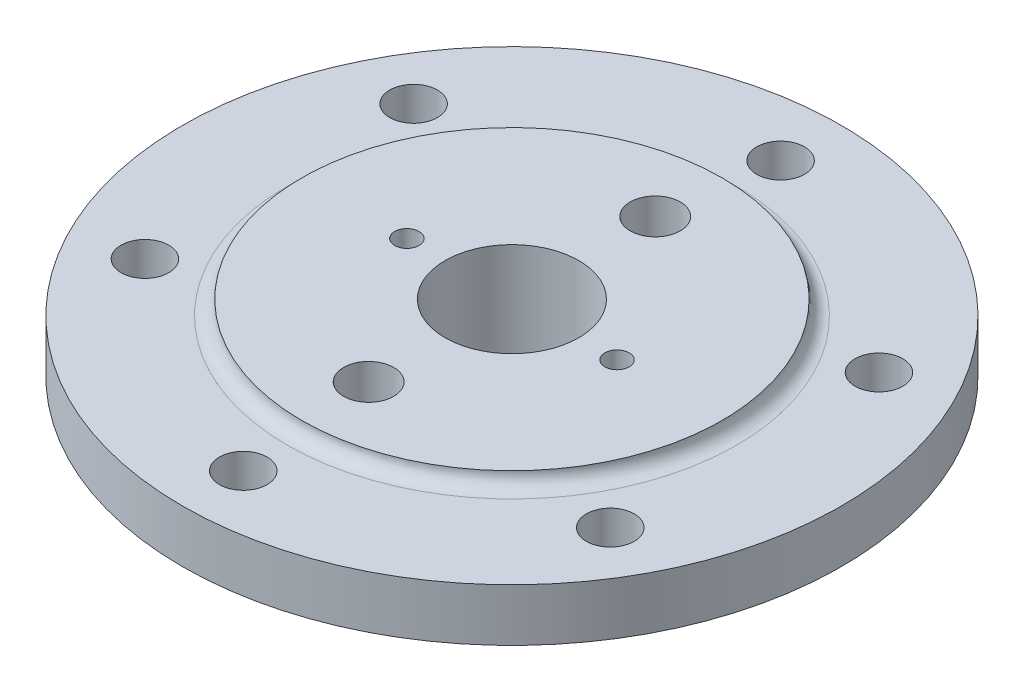
ISO-10303-21;
HEADER;
FILE_DESCRIPTION(('STEP AP214'),'2;1');
FILE_NAME('part.step','',(''),(''),'','','');
FILE_SCHEMA(('AUTOMOTIVE_DESIGN { 1 0 10303 214 1 1 1 1 }'));
ENDSEC;
DATA;
#1=APPLICATION_CONTEXT('core data for automotive mechanical design processes');
#2=APPLICATION_PROTOCOL_DEFINITION('international standard','automotive_design',2000,#1);
#3=PRODUCT_CONTEXT('',#1,'mechanical');
#4=PRODUCT('Part','Part','',(#3));
#5=PRODUCT_RELATED_PRODUCT_CATEGORY('part','',(#4));
#6=PRODUCT_DEFINITION_FORMATION('','',#4);
#7=PRODUCT_DEFINITION_CONTEXT('part definition',#1,'design');
#8=PRODUCT_DEFINITION('design','',#6,#7);
#9=PRODUCT_DEFINITION_SHAPE('','',#8);
#10=(LENGTH_UNIT() NAMED_UNIT(*) SI_UNIT(.MILLI.,.METRE.));
#11=(NAMED_UNIT(*) PLANE_ANGLE_UNIT() SI_UNIT($,.RADIAN.));
#12=(NAMED_UNIT(*) SI_UNIT($,.STERADIAN.) SOLID_ANGLE_UNIT());
#13=UNCERTAINTY_MEASURE_WITH_UNIT(LENGTH_MEASURE(1.E-05),#10,'distance_accuracy_value','');
#14=(GEOMETRIC_REPRESENTATION_CONTEXT(3) GLOBAL_UNCERTAINTY_ASSIGNED_CONTEXT((#13)) GLOBAL_UNIT_ASSIGNED_CONTEXT((#10,
#11,#12)) REPRESENTATION_CONTEXT('',''));
#15=CARTESIAN_POINT('',(0.,0.,0.));
#16=DIRECTION('',(0.,0.,1.));
#17=DIRECTION('',(1.,0.,0.));
#18=AXIS2_PLACEMENT_3D('',#15,#16,#17);
#19=CARTESIAN_POINT('',(0.,28.,0.));
#20=DIRECTION('',(0.,1.,0.));
#21=DIRECTION('',(0.,0.,1.));
#22=AXIS2_PLACEMENT_3D('',#19,#20,#21);
#23=CYLINDRICAL_SURFACE('',#22,14.);
#24=CARTESIAN_POINT('',(0.,0.,0.));
#25=DIRECTION('',(0.,1.,0.));
#26=DIRECTION('',(0.,0.,1.));
#27=AXIS2_PLACEMENT_3D('',#24,#25,#26);
#28=CIRCLE('',#27,14.);
#29=CARTESIAN_POINT('',(0.,0.,14.));
#30=VERTEX_POINT('',#29);
#31=EDGE_CURVE('E116',#30,#30,#28,.T.);
#32=ORIENTED_EDGE('',*,*,#31,.F.);
#33=EDGE_LOOP('',(#32));
#34=FACE_BOUND('',#33,.T.);
#35=CARTESIAN_POINT('',(0.,25.,0.));
#36=DIRECTION('',(0.,1.,0.));
#37=DIRECTION('',(0.,0.,1.));
#38=AXIS2_PLACEMENT_3D('',#35,#36,#37);
#39=CIRCLE('',#38,14.);
#40=CARTESIAN_POINT('',(0.,25.,14.));
#41=VERTEX_POINT('',#40);
#42=EDGE_CURVE('E11',#41,#41,#39,.T.);
#43=ORIENTED_EDGE('',*,*,#42,.T.);
#44=EDGE_LOOP('',(#43));
#45=FACE_BOUND('',#44,.T.);
#46=ADVANCED_FACE('F44',(#34,#45),#23,.F.);
#47=CARTESIAN_POINT('',(0.,39.3043478260869,0.));
#48=DIRECTION('',(0.,1.,0.));
#49=DIRECTION('',(0.,0.,1.));
#50=AXIS2_PLACEMENT_3D('',#47,#48,#49);
#51=CONICAL_SURFACE('',#50,28.,0.774645889606347);
#52=ORIENTED_EDGE('',*,*,#42,.F.);
#53=EDGE_LOOP('',(#52));
#54=FACE_BOUND('',#53,.T.);
#55=CARTESIAN_POINT('',(0.,39.3043478260869,0.));
#56=DIRECTION('',(0.,1.,0.));
#57=DIRECTION('',(0.,0.,1.));
#58=AXIS2_PLACEMENT_3D('',#55,#56,#57);
#59=CIRCLE('',#58,28.);
#60=CARTESIAN_POINT('',(0.,39.3043478260869,28.));
#61=VERTEX_POINT('',#60);
#62=EDGE_CURVE('E52',#61,#61,#59,.T.);
#63=ORIENTED_EDGE('',*,*,#62,.T.);
#64=EDGE_LOOP('',(#63));
#65=FACE_BOUND('',#64,.T.);
#66=ADVANCED_FACE('F193',(#54,#65),#51,.F.);
#67=CARTESIAN_POINT('',(0.,28.,0.));
#68=DIRECTION('',(0.,1.,0.));
#69=DIRECTION('',(0.,0.,1.));
#70=AXIS2_PLACEMENT_3D('',#67,#68,#69);
#71=CYLINDRICAL_SURFACE('',#70,28.);
#72=ORIENTED_EDGE('',*,*,#62,.F.);
#73=EDGE_LOOP('',(#72));
#74=FACE_BOUND('',#73,.T.);
#75=CARTESIAN_POINT('',(0.,81.,0.));
#76=DIRECTION('',(0.,1.,0.));
#77=DIRECTION('',(0.,0.,1.));
#78=AXIS2_PLACEMENT_3D('',#75,#76,#77);
#79=CIRCLE('',#78,28.);
#80=CARTESIAN_POINT('',(0.,81.,28.));
#81=VERTEX_POINT('',#80);
#82=EDGE_CURVE('E186',#81,#81,#79,.T.);
#83=ORIENTED_EDGE('',*,*,#82,.T.);
#84=EDGE_LOOP('',(#83));
#85=FACE_BOUND('',#84,.T.);
#86=ADVANCED_FACE('F195',(#74,#85),#71,.F.);
#87=CARTESIAN_POINT('',(0.,81.,-88.));
#88=DIRECTION('',(0.,-1.,0.));
#89=DIRECTION('',(0.,0.,-1.));
#90=AXIS2_PLACEMENT_3D('',#87,#88,#89);
#91=PLANE('',#90);
#92=CARTESIAN_POINT('',(44.,81.,0.));
#93=DIRECTION('',(0.,1.,0.));
#94=DIRECTION('',(0.,0.,1.));
#95=AXIS2_PLACEMENT_3D('',#92,#93,#94);
#96=CIRCLE('',#95,5.09999999999999);
#97=CARTESIAN_POINT('',(44.,81.,5.09999999999999));
#98=VERTEX_POINT('',#97);
#99=EDGE_CURVE('E77',#98,#98,#96,.T.);
#100=ORIENTED_EDGE('',*,*,#99,.F.);
#101=EDGE_LOOP('',(#100));
#102=FACE_BOUND('',#101,.T.);
#103=CARTESIAN_POINT('',(-44.,81.,0.));
#104=DIRECTION('',(0.,1.,0.));
#105=DIRECTION('',(0.,0.,1.));
#106=AXIS2_PLACEMENT_3D('',#103,#104,#105);
#107=CIRCLE('',#106,5.09999999999999);
#108=CARTESIAN_POINT('',(-44.,81.,5.09999999999999));
#109=VERTEX_POINT('',#108);
#110=EDGE_CURVE('E76',#109,#109,#107,.T.);
#111=ORIENTED_EDGE('',*,*,#110,.F.);
#112=EDGE_LOOP('',(#111));
#113=FACE_BOUND('',#112,.T.);
#114=CARTESIAN_POINT('',(0.,81.,-60.));
#115=DIRECTION('',(0.,1.,0.));
#116=DIRECTION('',(0.,0.,1.));
#117=AXIS2_PLACEMENT_3D('',#114,#115,#116);
#118=CIRCLE('',#117,10.5);
#119=CARTESIAN_POINT('',(0.,81.,-49.5));
#120=VERTEX_POINT('',#119);
#121=EDGE_CURVE('E90',#120,#120,#118,.T.);
#122=ORIENTED_EDGE('',*,*,#121,.F.);
#123=EDGE_LOOP('',(#122));
#124=FACE_BOUND('',#123,.T.);
#125=CARTESIAN_POINT('',(0.,81.,60.));
#126=DIRECTION('',(0.,1.,0.));
#127=DIRECTION('',(0.,0.,1.));
#128=AXIS2_PLACEMENT_3D('',#125,#126,#127);
#129=CIRCLE('',#128,10.5);
#130=CARTESIAN_POINT('',(0.,81.,70.5));
#131=VERTEX_POINT('',#130);
#132=EDGE_CURVE('E98',#131,#131,#129,.T.);
#133=ORIENTED_EDGE('',*,*,#132,.F.);
#134=EDGE_LOOP('',(#133));
#135=FACE_BOUND('',#134,.T.);
#136=ORIENTED_EDGE('',*,*,#82,.F.);
#137=EDGE_LOOP('',(#136));
#138=FACE_BOUND('',#137,.T.);
#139=CARTESIAN_POINT('',(0.,81.,0.));
#140=DIRECTION('',(0.,1.,0.));
#141=DIRECTION('',(0.,0.,1.));
#142=AXIS2_PLACEMENT_3D('',#139,#140,#141);
#143=CIRCLE('',#142,88.);
#144=CARTESIAN_POINT('',(0.,81.,88.));
#145=VERTEX_POINT('',#144);
#146=EDGE_CURVE('E182',#145,#145,#143,.T.);
#147=ORIENTED_EDGE('',*,*,#146,.T.);
#148=EDGE_LOOP('',(#147));
#149=FACE_BOUND('',#148,.T.);
#150=ADVANCED_FACE('F198',(#102,#113,#124,#135,#138,#149),#91,.F.);
#151=CARTESIAN_POINT('',(0.,81.,0.));
#152=DIRECTION('',(0.,1.,0.));
#153=DIRECTION('',(0.,0.,1.));
#154=AXIS2_PLACEMENT_3D('',#151,#152,#153);
#155=TOROIDAL_SURFACE('',#154,94.,6.00000000000001);
#156=ORIENTED_EDGE('',*,*,#146,.F.);
#157=EDGE_LOOP('',(#156));
#158=FACE_BOUND('',#157,.T.);
#159=CARTESIAN_POINT('',(0.,75.,0.));
#160=DIRECTION('',(0.,1.,0.));
#161=DIRECTION('',(0.,0.,1.));
#162=AXIS2_PLACEMENT_3D('',#159,#160,#161);
#163=CIRCLE('',#162,94.);
#164=CARTESIAN_POINT('',(0.,75.,94.));
#165=VERTEX_POINT('',#164);
#166=EDGE_CURVE('E178',#165,#165,#163,.T.);
#167=ORIENTED_EDGE('',*,*,#166,.T.);
#168=EDGE_LOOP('',(#167));
#169=FACE_BOUND('',#168,.T.);
#170=ADVANCED_FACE('F204',(#158,#169),#155,.F.);
#171=CARTESIAN_POINT('',(0.,75.,-138.));
#172=DIRECTION('',(0.,-1.,0.));
#173=DIRECTION('',(0.,0.,-1.));
#174=AXIS2_PLACEMENT_3D('',#171,#172,#173);
#175=PLANE('',#174);
#176=CARTESIAN_POINT('',(0.,75.,-112.5));
#177=DIRECTION('',(0.,1.,0.));
#178=DIRECTION('',(0.,0.,1.));
#179=AXIS2_PLACEMENT_3D('',#176,#177,#178);
#180=CIRCLE('',#179,10.);
#181=CARTESIAN_POINT('',(0.,75.,-102.5));
#182=VERTEX_POINT('',#181);
#183=EDGE_CURVE('E107',#182,#182,#180,.T.);
#184=ORIENTED_EDGE('',*,*,#183,.F.);
#185=EDGE_LOOP('',(#184));
#186=FACE_BOUND('',#185,.T.);
#187=CARTESIAN_POINT('',(-97.4278579257487,75.,-56.2500000000012));
#188=DIRECTION('',(0.,1.,0.));
#189=DIRECTION('',(0.,0.,1.));
#190=AXIS2_PLACEMENT_3D('',#187,#188,#189);
#191=CIRCLE('',#190,10.);
#192=CARTESIAN_POINT('',(-97.4278579257487,75.,-46.2500000000012));
#193=VERTEX_POINT('',#192);
#194=EDGE_CURVE('E106',#193,#193,#191,.T.);
#195=ORIENTED_EDGE('',*,*,#194,.F.);
#196=EDGE_LOOP('',(#195));
#197=FACE_BOUND('',#196,.T.);
#198=CARTESIAN_POINT('',(-97.427857925747,75.,56.2500000000014));
#199=DIRECTION('',(0.,1.,0.));
#200=DIRECTION('',(0.,0.,1.));
#201=AXIS2_PLACEMENT_3D('',#198,#199,#200);
#202=CIRCLE('',#201,10.0000000000037);
#203=CARTESIAN_POINT('',(-97.427857925747,75.,66.2500000000051));
#204=VERTEX_POINT('',#203);
#205=EDGE_CURVE('E124',#204,#204,#202,.T.);
#206=ORIENTED_EDGE('',*,*,#205,.F.);
#207=EDGE_LOOP('',(#206));
#208=FACE_BOUND('',#207,.T.);
#209=CARTESIAN_POINT('',(3.15611048144923E-12,75.,112.5));
#210=DIRECTION('',(0.,1.,0.));
#211=DIRECTION('',(0.,0.,1.));
#212=AXIS2_PLACEMENT_3D('',#209,#210,#211);
#213=CIRCLE('',#212,10.0000000000038);
#214=CARTESIAN_POINT('',(3.15611048144923E-12,75.,122.500000000004));
#215=VERTEX_POINT('',#214);
#216=EDGE_CURVE('E141',#215,#215,#213,.T.);
#217=ORIENTED_EDGE('',*,*,#216,.F.);
#218=EDGE_LOOP('',(#217));
#219=FACE_BOUND('',#218,.T.);
#220=CARTESIAN_POINT('',(97.4278579257517,75.,56.2499999999986));
#221=DIRECTION('',(0.,1.,0.));
#222=DIRECTION('',(0.,0.,1.));
#223=AXIS2_PLACEMENT_3D('',#220,#221,#222);
#224=CIRCLE('',#223,10.0000000000024);
#225=CARTESIAN_POINT('',(97.4278579257517,75.,66.250000000001));
#226=VERTEX_POINT('',#225);
#227=EDGE_CURVE('E133',#226,#226,#224,.T.);
#228=ORIENTED_EDGE('',*,*,#227,.F.);
#229=EDGE_LOOP('',(#228));
#230=FACE_BOUND('',#229,.T.);
#231=CARTESIAN_POINT('',(97.4278579257495,75.,-56.2499999999998));
#232=DIRECTION('',(0.,1.,0.));
#233=DIRECTION('',(0.,0.,1.));
#234=AXIS2_PLACEMENT_3D('',#231,#232,#233);
#235=CIRCLE('',#234,9.99999999999999);
#236=CARTESIAN_POINT('',(97.4278579257495,75.,-46.2499999999998));
#237=VERTEX_POINT('',#236);
#238=EDGE_CURVE('E125',#237,#237,#235,.T.);
#239=ORIENTED_EDGE('',*,*,#238,.F.);
#240=EDGE_LOOP('',(#239));
#241=FACE_BOUND('',#240,.T.);
#242=ORIENTED_EDGE('',*,*,#166,.F.);
#243=EDGE_LOOP('',(#242));
#244=FACE_BOUND('',#243,.T.);
#245=CARTESIAN_POINT('',(0.,75.,0.));
#246=DIRECTION('',(0.,1.,0.));
#247=DIRECTION('',(0.,0.,1.));
#248=AXIS2_PLACEMENT_3D('',#245,#246,#247);
#249=CIRCLE('',#248,138.);
#250=CARTESIAN_POINT('',(0.,75.,138.));
#251=VERTEX_POINT('',#250);
#252=EDGE_CURVE('E174',#251,#251,#249,.T.);
#253=ORIENTED_EDGE('',*,*,#252,.T.);
#254=EDGE_LOOP('',(#253));
#255=FACE_BOUND('',#254,.T.);
#256=ADVANCED_FACE('F211',(#186,#197,#208,#219,#230,#241,#244,#255),#175,.F.);
#257=CARTESIAN_POINT('',(0.,28.,0.));
#258=DIRECTION('',(0.,1.,0.));
#259=DIRECTION('',(0.,0.,1.));
#260=AXIS2_PLACEMENT_3D('',#257,#258,#259);
#261=CYLINDRICAL_SURFACE('',#260,138.);
#262=ORIENTED_EDGE('',*,*,#252,.F.);
#263=EDGE_LOOP('',(#262));
#264=FACE_BOUND('',#263,.T.);
#265=CARTESIAN_POINT('',(0.,53.,0.));
#266=DIRECTION('',(0.,1.,0.));
#267=DIRECTION('',(0.,0.,1.));
#268=AXIS2_PLACEMENT_3D('',#265,#266,#267);
#269=CIRCLE('',#268,138.);
#270=CARTESIAN_POINT('',(0.,53.,138.));
#271=VERTEX_POINT('',#270);
#272=EDGE_CURVE('E170',#271,#271,#269,.T.);
#273=ORIENTED_EDGE('',*,*,#272,.T.);
#274=EDGE_LOOP('',(#273));
#275=FACE_BOUND('',#274,.T.);
#276=ADVANCED_FACE('F217',(#264,#275),#261,.T.);
#277=CARTESIAN_POINT('',(0.,53.,-81.));
#278=DIRECTION('',(0.,1.,0.));
#279=DIRECTION('',(0.,0.,1.));
#280=AXIS2_PLACEMENT_3D('',#277,#278,#279);
#281=PLANE('',#280);
#282=CARTESIAN_POINT('',(0.,53.,-112.5));
#283=DIRECTION('',(0.,1.,0.));
#284=DIRECTION('',(0.,0.,1.));
#285=AXIS2_PLACEMENT_3D('',#282,#283,#284);
#286=CIRCLE('',#285,10.);
#287=CARTESIAN_POINT('',(0.,53.,-102.5));
#288=VERTEX_POINT('',#287);
#289=EDGE_CURVE('E111',#288,#288,#286,.F.);
#290=ORIENTED_EDGE('',*,*,#289,.F.);
#291=EDGE_LOOP('',(#290));
#292=FACE_BOUND('',#291,.T.);
#293=CARTESIAN_POINT('',(-97.4278579257487,53.,-56.2500000000012));
#294=DIRECTION('',(0.,1.,0.));
#295=DIRECTION('',(0.,0.,1.));
#296=AXIS2_PLACEMENT_3D('',#293,#294,#295);
#297=CIRCLE('',#296,10.);
#298=CARTESIAN_POINT('',(-97.4278579257487,53.,-46.2500000000012));
#299=VERTEX_POINT('',#298);
#300=EDGE_CURVE('E120',#299,#299,#297,.F.);
#301=ORIENTED_EDGE('',*,*,#300,.F.);
#302=EDGE_LOOP('',(#301));
#303=FACE_BOUND('',#302,.T.);
#304=CARTESIAN_POINT('',(-97.427857925747,53.,56.2500000000014));
#305=DIRECTION('',(0.,1.,0.));
#306=DIRECTION('',(0.,0.,1.));
#307=AXIS2_PLACEMENT_3D('',#304,#305,#306);
#308=CIRCLE('',#307,10.0000000000037);
#309=CARTESIAN_POINT('',(-97.427857925747,53.,66.2500000000051));
#310=VERTEX_POINT('',#309);
#311=EDGE_CURVE('E145',#310,#310,#308,.F.);
#312=ORIENTED_EDGE('',*,*,#311,.F.);
#313=EDGE_LOOP('',(#312));
#314=FACE_BOUND('',#313,.T.);
#315=CARTESIAN_POINT('',(3.15611048144923E-12,53.,112.5));
#316=DIRECTION('',(0.,1.,0.));
#317=DIRECTION('',(0.,0.,1.));
#318=AXIS2_PLACEMENT_3D('',#315,#316,#317);
#319=CIRCLE('',#318,10.0000000000038);
#320=CARTESIAN_POINT('',(3.15611048144923E-12,53.,122.500000000004));
#321=VERTEX_POINT('',#320);
#322=EDGE_CURVE('E137',#321,#321,#319,.F.);
#323=ORIENTED_EDGE('',*,*,#322,.F.);
#324=EDGE_LOOP('',(#323));
#325=FACE_BOUND('',#324,.T.);
#326=CARTESIAN_POINT('',(97.4278579257517,53.,56.2499999999986));
#327=DIRECTION('',(0.,1.,0.));
#328=DIRECTION('',(0.,0.,1.));
#329=AXIS2_PLACEMENT_3D('',#326,#327,#328);
#330=CIRCLE('',#329,10.0000000000024);
#331=CARTESIAN_POINT('',(97.4278579257517,53.,66.250000000001));
#332=VERTEX_POINT('',#331);
#333=EDGE_CURVE('E129',#332,#332,#330,.F.);
#334=ORIENTED_EDGE('',*,*,#333,.F.);
#335=EDGE_LOOP('',(#334));
#336=FACE_BOUND('',#335,.T.);
#337=CARTESIAN_POINT('',(97.4278579257495,53.,-56.2499999999998));
#338=DIRECTION('',(0.,1.,0.));
#339=DIRECTION('',(0.,0.,1.));
#340=AXIS2_PLACEMENT_3D('',#337,#338,#339);
#341=CIRCLE('',#340,9.99999999999999);
#342=CARTESIAN_POINT('',(97.4278579257495,53.,-46.2499999999998));
#343=VERTEX_POINT('',#342);
#344=EDGE_CURVE('E112',#343,#343,#341,.F.);
#345=ORIENTED_EDGE('',*,*,#344,.F.);
#346=EDGE_LOOP('',(#345));
#347=FACE_BOUND('',#346,.T.);
#348=ORIENTED_EDGE('',*,*,#272,.F.);
#349=EDGE_LOOP('',(#348));
#350=FACE_BOUND('',#349,.T.);
#351=CARTESIAN_POINT('',(0.,53.,0.));
#352=DIRECTION('',(0.,1.,0.));
#353=DIRECTION('',(0.,0.,1.));
#354=AXIS2_PLACEMENT_3D('',#351,#352,#353);
#355=CIRCLE('',#354,81.);
#356=CARTESIAN_POINT('',(0.,53.,81.));
#357=VERTEX_POINT('',#356);
#358=EDGE_CURVE('E166',#357,#357,#355,.T.);
#359=ORIENTED_EDGE('',*,*,#358,.T.);
#360=EDGE_LOOP('',(#359));
#361=FACE_BOUND('',#360,.T.);
#362=ADVANCED_FACE('F224',(#292,#303,#314,#325,#336,#347,#350,#361),#281,.F.);
#363=CARTESIAN_POINT('',(0.,28.,0.));
#364=DIRECTION('',(0.,1.,0.));
#365=DIRECTION('',(0.,0.,1.));
#366=AXIS2_PLACEMENT_3D('',#363,#364,#365);
#367=CYLINDRICAL_SURFACE('',#366,81.);
#368=ORIENTED_EDGE('',*,*,#358,.F.);
#369=EDGE_LOOP('',(#368));
#370=FACE_BOUND('',#369,.T.);
#371=CARTESIAN_POINT('',(0.,47.,0.));
#372=DIRECTION('',(0.,1.,0.));
#373=DIRECTION('',(0.,0.,1.));
#374=AXIS2_PLACEMENT_3D('',#371,#372,#373);
#375=CIRCLE('',#374,81.);
#376=CARTESIAN_POINT('',(0.,47.,81.));
#377=VERTEX_POINT('',#376);
#378=EDGE_CURVE('E162',#377,#377,#375,.T.);
#379=ORIENTED_EDGE('',*,*,#378,.T.);
#380=EDGE_LOOP('',(#379));
#381=FACE_BOUND('',#380,.T.);
#382=ADVANCED_FACE('F230',(#370,#381),#367,.T.);
#383=CARTESIAN_POINT('',(0.,0.,0.));
#384=DIRECTION('',(0.,1.,0.));
#385=DIRECTION('',(0.,0.,1.));
#386=AXIS2_PLACEMENT_3D('',#383,#384,#385);
#387=CONICAL_SURFACE('',#386,35.,0.774645889606347);
#388=ORIENTED_EDGE('',*,*,#378,.F.);
#389=EDGE_LOOP('',(#388));
#390=FACE_BOUND('',#389,.T.);
#391=CARTESIAN_POINT('',(0.,0.,0.));
#392=DIRECTION('',(0.,1.,0.));
#393=DIRECTION('',(0.,0.,1.));
#394=AXIS2_PLACEMENT_3D('',#391,#392,#393);
#395=CIRCLE('',#394,35.);
#396=CARTESIAN_POINT('',(0.,0.,35.));
#397=VERTEX_POINT('',#396);
#398=EDGE_CURVE('E158',#397,#397,#395,.T.);
#399=ORIENTED_EDGE('',*,*,#398,.T.);
#400=EDGE_LOOP('',(#399));
#401=FACE_BOUND('',#400,.T.);
#402=ADVANCED_FACE('F237',(#390,#401),#387,.T.);
#403=CARTESIAN_POINT('',(0.,0.,-14.));
#404=DIRECTION('',(0.,1.,0.));
#405=DIRECTION('',(0.,0.,1.));
#406=AXIS2_PLACEMENT_3D('',#403,#404,#405);
#407=PLANE('',#406);
#408=ORIENTED_EDGE('',*,*,#398,.F.);
#409=EDGE_LOOP('',(#408));
#410=FACE_BOUND('',#409,.T.);
#411=ORIENTED_EDGE('',*,*,#31,.T.);
#412=EDGE_LOOP('',(#411));
#413=FACE_BOUND('',#412,.T.);
#414=ADVANCED_FACE('F243',(#410,#413),#407,.F.);
#415=CARTESIAN_POINT('',(97.4278579257495,-0.001000000000001,-56.2499999999998));
#416=DIRECTION('',(0.,1.,0.));
#417=DIRECTION('',(0.,0.,1.));
#418=AXIS2_PLACEMENT_3D('',#415,#416,#417);
#419=CYLINDRICAL_SURFACE('',#418,9.99999999999999);
#420=ORIENTED_EDGE('',*,*,#238,.T.);
#421=EDGE_LOOP('',(#420));
#422=FACE_BOUND('',#421,.T.);
#423=ORIENTED_EDGE('',*,*,#344,.T.);
#424=EDGE_LOOP('',(#423));
#425=FACE_BOUND('',#424,.T.);
#426=ADVANCED_FACE('F249',(#422,#425),#419,.F.);
#427=CARTESIAN_POINT('',(97.4278579257517,-0.001000000000001,56.2499999999986));
#428=DIRECTION('',(0.,1.,0.));
#429=DIRECTION('',(0.,0.,1.));
#430=AXIS2_PLACEMENT_3D('',#427,#428,#429);
#431=CYLINDRICAL_SURFACE('',#430,10.0000000000024);
#432=ORIENTED_EDGE('',*,*,#227,.T.);
#433=EDGE_LOOP('',(#432));
#434=FACE_BOUND('',#433,.T.);
#435=ORIENTED_EDGE('',*,*,#333,.T.);
#436=EDGE_LOOP('',(#435));
#437=FACE_BOUND('',#436,.T.);
#438=ADVANCED_FACE('F269',(#434,#437),#431,.F.);
#439=CARTESIAN_POINT('',(3.15611048144923E-12,-0.001000000000001,112.5));
#440=DIRECTION('',(0.,1.,0.));
#441=DIRECTION('',(0.,0.,1.));
#442=AXIS2_PLACEMENT_3D('',#439,#440,#441);
#443=CYLINDRICAL_SURFACE('',#442,10.0000000000038);
#444=ORIENTED_EDGE('',*,*,#216,.T.);
#445=EDGE_LOOP('',(#444));
#446=FACE_BOUND('',#445,.T.);
#447=ORIENTED_EDGE('',*,*,#322,.T.);
#448=EDGE_LOOP('',(#447));
#449=FACE_BOUND('',#448,.T.);
#450=ADVANCED_FACE('F265',(#446,#449),#443,.F.);
#451=CARTESIAN_POINT('',(-97.427857925747,-0.001000000000001,56.2500000000014));
#452=DIRECTION('',(0.,1.,0.));
#453=DIRECTION('',(0.,0.,1.));
#454=AXIS2_PLACEMENT_3D('',#451,#452,#453);
#455=CYLINDRICAL_SURFACE('',#454,10.0000000000037);
#456=ORIENTED_EDGE('',*,*,#205,.T.);
#457=EDGE_LOOP('',(#456));
#458=FACE_BOUND('',#457,.T.);
#459=ORIENTED_EDGE('',*,*,#311,.T.);
#460=EDGE_LOOP('',(#459));
#461=FACE_BOUND('',#460,.T.);
#462=ADVANCED_FACE('F261',(#458,#461),#455,.F.);
#463=CARTESIAN_POINT('',(-97.4278579257487,-0.001000000000001,-56.2500000000012));
#464=DIRECTION('',(0.,1.,0.));
#465=DIRECTION('',(0.,0.,1.));
#466=AXIS2_PLACEMENT_3D('',#463,#464,#465);
#467=CYLINDRICAL_SURFACE('',#466,10.);
#468=ORIENTED_EDGE('',*,*,#194,.T.);
#469=EDGE_LOOP('',(#468));
#470=FACE_BOUND('',#469,.T.);
#471=ORIENTED_EDGE('',*,*,#300,.T.);
#472=EDGE_LOOP('',(#471));
#473=FACE_BOUND('',#472,.T.);
#474=ADVANCED_FACE('F264',(#470,#473),#467,.F.);
#475=CARTESIAN_POINT('',(0.,-0.001000000000001,-112.5));
#476=DIRECTION('',(0.,1.,0.));
#477=DIRECTION('',(0.,0.,1.));
#478=AXIS2_PLACEMENT_3D('',#475,#476,#477);
#479=CYLINDRICAL_SURFACE('',#478,10.);
#480=ORIENTED_EDGE('',*,*,#183,.T.);
#481=EDGE_LOOP('',(#480));
#482=FACE_BOUND('',#481,.T.);
#483=ORIENTED_EDGE('',*,*,#289,.T.);
#484=EDGE_LOOP('',(#483));
#485=FACE_BOUND('',#484,.T.);
#486=ADVANCED_FACE('F279',(#482,#485),#479,.F.);
#487=CARTESIAN_POINT('',(0.,54.,60.));
#488=DIRECTION('',(0.,1.,0.));
#489=DIRECTION('',(0.,0.,1.));
#490=AXIS2_PLACEMENT_3D('',#487,#488,#489);
#491=CONICAL_SURFACE('',#490,10.5,1.02974425867665);
#492=CARTESIAN_POINT('',(0.,47.6909635002106,60.));
#493=VERTEX_POINT('',#492);
#494=VERTEX_LOOP('',#493);
#495=FACE_BOUND('',#494,.T.);
#496=CARTESIAN_POINT('',(0.,54.,60.));
#497=DIRECTION('',(0.,1.,0.));
#498=DIRECTION('',(0.,0.,1.));
#499=AXIS2_PLACEMENT_3D('',#496,#497,#498);
#500=CIRCLE('',#499,10.5);
#501=CARTESIAN_POINT('',(0.,54.,70.5));
#502=VERTEX_POINT('',#501);
#503=EDGE_CURVE('E102',#502,#502,#500,.T.);
#504=ORIENTED_EDGE('',*,*,#503,.T.);
#505=EDGE_LOOP('',(#504));
#506=FACE_BOUND('',#505,.T.);
#507=ADVANCED_FACE('F283',(#495,#506),#491,.F.);
#508=CARTESIAN_POINT('',(0.,81.,60.));
#509=DIRECTION('',(0.,1.,0.));
#510=DIRECTION('',(0.,0.,1.));
#511=AXIS2_PLACEMENT_3D('',#508,#509,#510);
#512=CYLINDRICAL_SURFACE('',#511,10.5);
#513=ORIENTED_EDGE('',*,*,#503,.F.);
#514=EDGE_LOOP('',(#513));
#515=FACE_BOUND('',#514,.T.);
#516=ORIENTED_EDGE('',*,*,#132,.T.);
#517=EDGE_LOOP('',(#516));
#518=FACE_BOUND('',#517,.T.);
#519=ADVANCED_FACE('F287',(#515,#518),#512,.F.);
#520=CARTESIAN_POINT('',(0.,54.,-60.));
#521=DIRECTION('',(0.,1.,0.));
#522=DIRECTION('',(0.,0.,1.));
#523=AXIS2_PLACEMENT_3D('',#520,#521,#522);
#524=CONICAL_SURFACE('',#523,10.5,1.02974425867665);
#525=CARTESIAN_POINT('',(0.,47.6909635002106,-60.));
#526=VERTEX_POINT('',#525);
#527=VERTEX_LOOP('',#526);
#528=FACE_BOUND('',#527,.T.);
#529=CARTESIAN_POINT('',(0.,54.,-60.));
#530=DIRECTION('',(0.,1.,0.));
#531=DIRECTION('',(0.,0.,1.));
#532=AXIS2_PLACEMENT_3D('',#529,#530,#531);
#533=CIRCLE('',#532,10.5);
#534=CARTESIAN_POINT('',(0.,54.,-49.5));
#535=VERTEX_POINT('',#534);
#536=EDGE_CURVE('E94',#535,#535,#533,.T.);
#537=ORIENTED_EDGE('',*,*,#536,.T.);
#538=EDGE_LOOP('',(#537));
#539=FACE_BOUND('',#538,.T.);
#540=ADVANCED_FACE('F290',(#528,#539),#524,.F.);
#541=CARTESIAN_POINT('',(0.,81.,-60.));
#542=DIRECTION('',(0.,1.,0.));
#543=DIRECTION('',(0.,0.,1.));
#544=AXIS2_PLACEMENT_3D('',#541,#542,#543);
#545=CYLINDRICAL_SURFACE('',#544,10.5);
#546=ORIENTED_EDGE('',*,*,#536,.F.);
#547=EDGE_LOOP('',(#546));
#548=FACE_BOUND('',#547,.T.);
#549=ORIENTED_EDGE('',*,*,#121,.T.);
#550=EDGE_LOOP('',(#549));
#551=FACE_BOUND('',#550,.T.);
#552=ADVANCED_FACE('F294',(#548,#551),#545,.F.);
#553=CARTESIAN_POINT('',(-44.,31.0000000000002,0.));
#554=DIRECTION('',(0.,1.,0.));
#555=DIRECTION('',(0.,0.,1.));
#556=AXIS2_PLACEMENT_3D('',#553,#554,#555);
#557=CONICAL_SURFACE('',#556,5.09999999999938,1.02974425867657);
#558=CARTESIAN_POINT('',(-44.,27.9356108429594,0.));
#559=VERTEX_POINT('',#558);
#560=VERTEX_LOOP('',#559);
#561=FACE_BOUND('',#560,.T.);
#562=CARTESIAN_POINT('',(-44.,31.0000000000002,0.));
#563=DIRECTION('',(0.,1.,0.));
#564=DIRECTION('',(0.,0.,1.));
#565=AXIS2_PLACEMENT_3D('',#562,#563,#564);
#566=CIRCLE('',#565,5.09999999999938);
#567=CARTESIAN_POINT('',(-44.,31.0000000000002,5.09999999999938));
#568=VERTEX_POINT('',#567);
#569=EDGE_CURVE('E82',#568,#568,#566,.T.);
#570=ORIENTED_EDGE('',*,*,#569,.T.);
#571=EDGE_LOOP('',(#570));
#572=FACE_BOUND('',#571,.T.);
#573=ADVANCED_FACE('F297',(#561,#572),#557,.F.);
#574=CARTESIAN_POINT('',(-44.,81.,0.));
#575=DIRECTION('',(0.,1.,0.));
#576=DIRECTION('',(0.,0.,1.));
#577=AXIS2_PLACEMENT_3D('',#574,#575,#576);
#578=CYLINDRICAL_SURFACE('',#577,5.09999999999968);
#579=ORIENTED_EDGE('',*,*,#569,.F.);
#580=EDGE_LOOP('',(#579));
#581=FACE_BOUND('',#580,.T.);
#582=ORIENTED_EDGE('',*,*,#110,.T.);
#583=EDGE_LOOP('',(#582));
#584=FACE_BOUND('',#583,.T.);
#585=ADVANCED_FACE('F69',(#581,#584),#578,.F.);
#586=CARTESIAN_POINT('',(44.,31.0000000000002,0.));
#587=DIRECTION('',(0.,1.,0.));
#588=DIRECTION('',(0.,0.,1.));
#589=AXIS2_PLACEMENT_3D('',#586,#587,#588);
#590=CONICAL_SURFACE('',#589,5.09999999999938,1.02974425867657);
#591=CARTESIAN_POINT('',(44.,27.9356108429594,0.));
#592=VERTEX_POINT('',#591);
#593=VERTEX_LOOP('',#592);
#594=FACE_BOUND('',#593,.T.);
#595=CARTESIAN_POINT('',(44.,31.0000000000002,0.));
#596=DIRECTION('',(0.,1.,0.));
#597=DIRECTION('',(0.,0.,1.));
#598=AXIS2_PLACEMENT_3D('',#595,#596,#597);
#599=CIRCLE('',#598,5.09999999999938);
#600=CARTESIAN_POINT('',(44.,31.0000000000002,5.09999999999938));
#601=VERTEX_POINT('',#600);
#602=EDGE_CURVE('E73',#601,#601,#599,.T.);
#603=ORIENTED_EDGE('',*,*,#602,.T.);
#604=EDGE_LOOP('',(#603));
#605=FACE_BOUND('',#604,.T.);
#606=ADVANCED_FACE('F65',(#594,#605),#590,.F.);
#607=CARTESIAN_POINT('',(44.,81.,0.));
#608=DIRECTION('',(0.,1.,0.));
#609=DIRECTION('',(0.,0.,1.));
#610=AXIS2_PLACEMENT_3D('',#607,#608,#609);
#611=CYLINDRICAL_SURFACE('',#610,5.09999999999968);
#612=ORIENTED_EDGE('',*,*,#602,.F.);
#613=EDGE_LOOP('',(#612));
#614=FACE_BOUND('',#613,.T.);
#615=ORIENTED_EDGE('',*,*,#99,.T.);
#616=EDGE_LOOP('',(#615));
#617=FACE_BOUND('',#616,.T.);
#618=ADVANCED_FACE('F68',(#614,#617),#611,.F.);
#619=CLOSED_SHELL('',(#46,#66,#86,#150,#170,#256,#276,#362,#382,#402,#414,#426,#438,#450,#462,
#474,#486,#507,#519,#540,#552,#573,#585,#606,#618));
#620=MANIFOLD_SOLID_BREP('B2',#619);
#621=ADVANCED_BREP_SHAPE_REPRESENTATION('',(#18,#620),#14);
#622=SHAPE_DEFINITION_REPRESENTATION(#9,#621);
ENDSEC;
END-ISO-10303-21;
